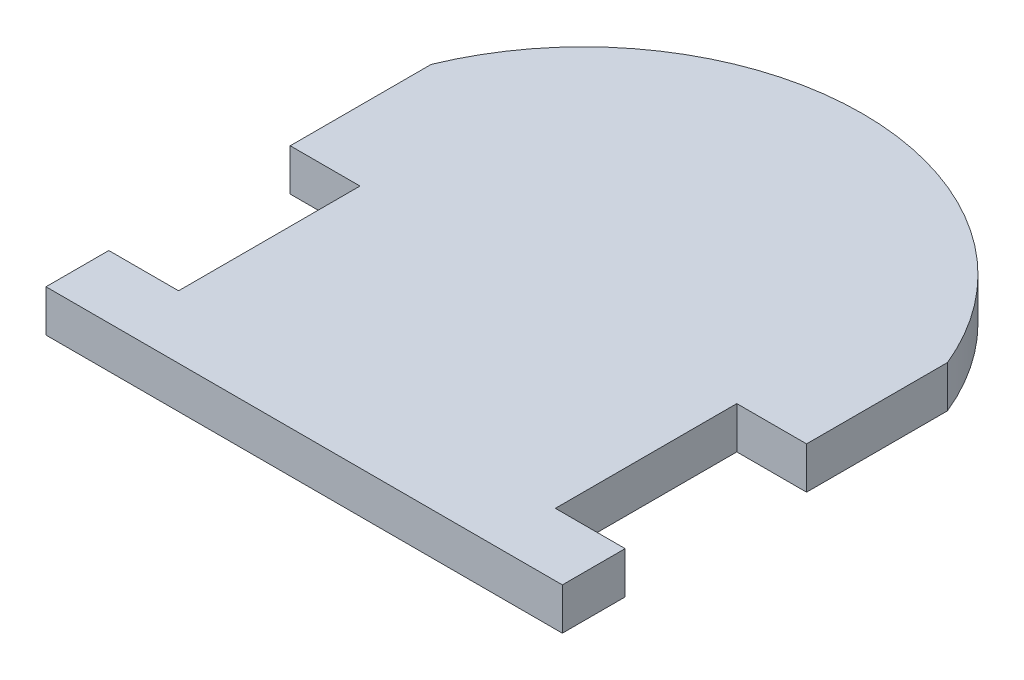
ISO-10303-21;
HEADER;
FILE_DESCRIPTION(('STEP AP214'),'2;1');
FILE_NAME('part.step','',(''),(''),'','','');
FILE_SCHEMA(('AUTOMOTIVE_DESIGN { 1 0 10303 214 1 1 1 1 }'));
ENDSEC;
DATA;
#1=APPLICATION_CONTEXT('core data for automotive mechanical design processes');
#2=APPLICATION_PROTOCOL_DEFINITION('international standard','automotive_design',2000,#1);
#3=PRODUCT_CONTEXT('',#1,'mechanical');
#4=PRODUCT('Part','Part','',(#3));
#5=PRODUCT_RELATED_PRODUCT_CATEGORY('part','',(#4));
#6=PRODUCT_DEFINITION_FORMATION('','',#4);
#7=PRODUCT_DEFINITION_CONTEXT('part definition',#1,'design');
#8=PRODUCT_DEFINITION('design','',#6,#7);
#9=PRODUCT_DEFINITION_SHAPE('','',#8);
#10=(LENGTH_UNIT() NAMED_UNIT(*) SI_UNIT(.MILLI.,.METRE.));
#11=(NAMED_UNIT(*) PLANE_ANGLE_UNIT() SI_UNIT($,.RADIAN.));
#12=(NAMED_UNIT(*) SI_UNIT($,.STERADIAN.) SOLID_ANGLE_UNIT());
#13=UNCERTAINTY_MEASURE_WITH_UNIT(LENGTH_MEASURE(1.E-05),#10,'distance_accuracy_value','');
#14=(GEOMETRIC_REPRESENTATION_CONTEXT(3) GLOBAL_UNCERTAINTY_ASSIGNED_CONTEXT((#13)) GLOBAL_UNIT_ASSIGNED_CONTEXT((#10,
#11,#12)) REPRESENTATION_CONTEXT('',''));
#15=CARTESIAN_POINT('',(0.,0.,0.));
#16=DIRECTION('',(0.,0.,1.));
#17=DIRECTION('',(1.,0.,0.));
#18=AXIS2_PLACEMENT_3D('',#15,#16,#17);
#19=CARTESIAN_POINT('',(18.5,3.,0.));
#20=DIRECTION('',(-1.,0.,0.));
#21=DIRECTION('',(0.,0.,1.));
#22=AXIS2_PLACEMENT_3D('',#19,#20,#21);
#23=PLANE('',#22);
#24=DIRECTION('',(0.,0.,-1.));
#25=VECTOR('',#24,1.);
#26=CARTESIAN_POINT('',(18.5,0.,0.));
#27=LINE('',#26,#25);
#28=CARTESIAN_POINT('',(18.5,0.,20.));
#29=VERTEX_POINT('',#28);
#30=CARTESIAN_POINT('',(18.5,0.,15.5));
#31=VERTEX_POINT('',#30);
#32=EDGE_CURVE('E178',#29,#31,#27,.T.);
#33=ORIENTED_EDGE('',*,*,#32,.T.);
#34=DIRECTION('',(0.,1.,0.));
#35=VECTOR('',#34,1.);
#36=CARTESIAN_POINT('',(18.5,3.,15.5));
#37=LINE('',#36,#35);
#38=CARTESIAN_POINT('',(18.5,3.,15.5));
#39=VERTEX_POINT('',#38);
#40=EDGE_CURVE('E159',#31,#39,#37,.T.);
#41=ORIENTED_EDGE('',*,*,#40,.T.);
#42=DIRECTION('',(0.,0.,-1.));
#43=VECTOR('',#42,1.);
#44=CARTESIAN_POINT('',(18.5,3.,0.));
#45=LINE('',#44,#43);
#46=CARTESIAN_POINT('',(18.5,3.,20.));
#47=VERTEX_POINT('',#46);
#48=EDGE_CURVE('E166',#47,#39,#45,.T.);
#49=ORIENTED_EDGE('',*,*,#48,.F.);
#50=DIRECTION('',(0.,-1.,0.));
#51=VECTOR('',#50,1.);
#52=CARTESIAN_POINT('',(18.5,3.,20.));
#53=LINE('',#52,#51);
#54=EDGE_CURVE('E177',#47,#29,#53,.T.);
#55=ORIENTED_EDGE('',*,*,#54,.T.);
#56=EDGE_LOOP('',(#33,#41,#49,#55));
#57=FACE_BOUND('',#56,.T.);
#58=ADVANCED_FACE('F35',(#57),#23,.F.);
#59=CARTESIAN_POINT('',(-18.5,3.,0.));
#60=DIRECTION('',(1.,0.,0.));
#61=DIRECTION('',(0.,0.,-1.));
#62=AXIS2_PLACEMENT_3D('',#59,#60,#61);
#63=PLANE('',#62);
#64=DIRECTION('',(0.,-1.,0.));
#65=VECTOR('',#64,1.);
#66=CARTESIAN_POINT('',(-18.5,3.,2.5));
#67=LINE('',#66,#65);
#68=CARTESIAN_POINT('',(-18.5,3.,2.5));
#69=VERTEX_POINT('',#68);
#70=CARTESIAN_POINT('',(-18.5,0.,2.5));
#71=VERTEX_POINT('',#70);
#72=EDGE_CURVE('E163',#69,#71,#67,.T.);
#73=ORIENTED_EDGE('',*,*,#72,.F.);
#74=DIRECTION('',(0.,0.,1.));
#75=VECTOR('',#74,1.);
#76=CARTESIAN_POINT('',(-18.5,3.,0.));
#77=LINE('',#76,#75);
#78=CARTESIAN_POINT('',(-18.5,3.,-7.59934207678534));
#79=VERTEX_POINT('',#78);
#80=EDGE_CURVE('E173',#79,#69,#77,.T.);
#81=ORIENTED_EDGE('',*,*,#80,.F.);
#82=DIRECTION('',(0.,-1.,0.));
#83=VECTOR('',#82,1.);
#84=CARTESIAN_POINT('',(-18.5,3.,-7.59934207678534));
#85=LINE('',#84,#83);
#86=CARTESIAN_POINT('',(-18.5,0.,-7.59934207678534));
#87=VERTEX_POINT('',#86);
#88=EDGE_CURVE('E194',#79,#87,#85,.T.);
#89=ORIENTED_EDGE('',*,*,#88,.T.);
#90=DIRECTION('',(0.,0.,1.));
#91=VECTOR('',#90,1.);
#92=CARTESIAN_POINT('',(-18.5,0.,0.));
#93=LINE('',#92,#91);
#94=EDGE_CURVE('E184',#87,#71,#93,.T.);
#95=ORIENTED_EDGE('',*,*,#94,.T.);
#96=EDGE_LOOP('',(#73,#81,#89,#95));
#97=FACE_BOUND('',#96,.T.);
#98=ADVANCED_FACE('F246',(#97),#63,.F.);
#99=DIRECTION('',(0.,1.,0.));
#100=VECTOR('',#99,1.);
#101=CARTESIAN_POINT('',(-18.5,3.,15.5));
#102=LINE('',#101,#100);
#103=CARTESIAN_POINT('',(-18.5,0.,15.5));
#104=VERTEX_POINT('',#103);
#105=CARTESIAN_POINT('',(-18.5,3.,15.5));
#106=VERTEX_POINT('',#105);
#107=EDGE_CURVE('E136',#104,#106,#102,.T.);
#108=ORIENTED_EDGE('',*,*,#107,.F.);
#109=CARTESIAN_POINT('',(-18.5,0.,20.));
#110=VERTEX_POINT('',#109);
#111=EDGE_CURVE('E183',#104,#110,#93,.T.);
#112=ORIENTED_EDGE('',*,*,#111,.T.);
#113=DIRECTION('',(0.,-1.,0.));
#114=VECTOR('',#113,1.);
#115=CARTESIAN_POINT('',(-18.5,3.,20.));
#116=LINE('',#115,#114);
#117=CARTESIAN_POINT('',(-18.5,3.,20.));
#118=VERTEX_POINT('',#117);
#119=EDGE_CURVE('E191',#118,#110,#116,.T.);
#120=ORIENTED_EDGE('',*,*,#119,.F.);
#121=EDGE_CURVE('E172',#106,#118,#77,.T.);
#122=ORIENTED_EDGE('',*,*,#121,.F.);
#123=EDGE_LOOP('',(#108,#112,#120,#122));
#124=FACE_BOUND('',#123,.T.);
#125=ADVANCED_FACE('F213',(#124),#63,.F.);
#126=CARTESIAN_POINT('',(0.,3.,0.));
#127=DIRECTION('',(0.,1.,0.));
#128=DIRECTION('',(0.,0.,1.));
#129=AXIS2_PLACEMENT_3D('',#126,#127,#128);
#130=PLANE('',#129);
#131=ORIENTED_EDGE('',*,*,#80,.T.);
#132=DIRECTION('',(1.,0.,0.));
#133=VECTOR('',#132,1.);
#134=CARTESIAN_POINT('',(0.,3.,2.5));
#135=LINE('',#134,#133);
#136=CARTESIAN_POINT('',(-13.5,3.,2.5));
#137=VERTEX_POINT('',#136);
#138=EDGE_CURVE('E130',#69,#137,#135,.T.);
#139=ORIENTED_EDGE('',*,*,#138,.T.);
#140=DIRECTION('',(0.,0.,1.));
#141=VECTOR('',#140,1.);
#142=CARTESIAN_POINT('',(-13.5,3.,0.));
#143=LINE('',#142,#141);
#144=CARTESIAN_POINT('',(-13.5,3.,15.5));
#145=VERTEX_POINT('',#144);
#146=EDGE_CURVE('E125',#137,#145,#143,.T.);
#147=ORIENTED_EDGE('',*,*,#146,.T.);
#148=DIRECTION('',(-1.,0.,0.));
#149=VECTOR('',#148,1.);
#150=CARTESIAN_POINT('',(0.,3.,15.5));
#151=LINE('',#150,#149);
#152=EDGE_CURVE('E133',#145,#106,#151,.T.);
#153=ORIENTED_EDGE('',*,*,#152,.T.);
#154=ORIENTED_EDGE('',*,*,#121,.T.);
#155=DIRECTION('',(1.,0.,0.));
#156=VECTOR('',#155,1.);
#157=CARTESIAN_POINT('',(0.,3.,20.));
#158=LINE('',#157,#156);
#159=EDGE_CURVE('E175',#118,#47,#158,.T.);
#160=ORIENTED_EDGE('',*,*,#159,.T.);
#161=ORIENTED_EDGE('',*,*,#48,.T.);
#162=DIRECTION('',(1.,0.,0.));
#163=VECTOR('',#162,1.);
#164=CARTESIAN_POINT('',(0.,3.,15.5));
#165=LINE('',#164,#163);
#166=CARTESIAN_POINT('',(13.5,3.,15.5));
#167=VERTEX_POINT('',#166);
#168=EDGE_CURVE('E148',#167,#39,#165,.T.);
#169=ORIENTED_EDGE('',*,*,#168,.F.);
#170=DIRECTION('',(0.,0.,1.));
#171=VECTOR('',#170,1.);
#172=CARTESIAN_POINT('',(13.5,3.,0.));
#173=LINE('',#172,#171);
#174=CARTESIAN_POINT('',(13.5,3.,2.5));
#175=VERTEX_POINT('',#174);
#176=EDGE_CURVE('E152',#175,#167,#173,.T.);
#177=ORIENTED_EDGE('',*,*,#176,.F.);
#178=DIRECTION('',(-1.,0.,0.));
#179=VECTOR('',#178,1.);
#180=CARTESIAN_POINT('',(0.,3.,2.5));
#181=LINE('',#180,#179);
#182=CARTESIAN_POINT('',(18.5,3.,2.5));
#183=VERTEX_POINT('',#182);
#184=EDGE_CURVE('E150',#183,#175,#181,.T.);
#185=ORIENTED_EDGE('',*,*,#184,.F.);
#186=CARTESIAN_POINT('',(18.5,3.,-7.59934207678533));
#187=VERTEX_POINT('',#186);
#188=EDGE_CURVE('E170',#183,#187,#45,.T.);
#189=ORIENTED_EDGE('',*,*,#188,.T.);
#190=CARTESIAN_POINT('',(0.,3.,0.));
#191=DIRECTION('',(0.,1.,0.));
#192=DIRECTION('',(0.,0.,1.));
#193=AXIS2_PLACEMENT_3D('',#190,#191,#192);
#194=CIRCLE('',#193,20.);
#195=EDGE_CURVE('E169',#187,#79,#194,.T.);
#196=ORIENTED_EDGE('',*,*,#195,.T.);
#197=EDGE_LOOP('',(#131,#139,#147,#153,#154,#160,#161,#169,#177,#185,#189,#196));
#198=FACE_BOUND('',#197,.T.);
#199=ADVANCED_FACE('F142',(#198),#130,.T.);
#200=CARTESIAN_POINT('',(0.,0.,0.));
#201=DIRECTION('',(0.,1.,0.));
#202=DIRECTION('',(0.,0.,1.));
#203=AXIS2_PLACEMENT_3D('',#200,#201,#202);
#204=PLANE('',#203);
#205=DIRECTION('',(1.,0.,0.));
#206=VECTOR('',#205,1.);
#207=CARTESIAN_POINT('',(0.,0.,2.5));
#208=LINE('',#207,#206);
#209=CARTESIAN_POINT('',(-13.5,0.,2.5));
#210=VERTEX_POINT('',#209);
#211=EDGE_CURVE('E11',#71,#210,#208,.T.);
#212=ORIENTED_EDGE('',*,*,#211,.F.);
#213=ORIENTED_EDGE('',*,*,#94,.F.);
#214=CARTESIAN_POINT('',(0.,0.,0.));
#215=DIRECTION('',(0.,1.,0.));
#216=DIRECTION('',(0.,0.,1.));
#217=AXIS2_PLACEMENT_3D('',#214,#215,#216);
#218=CIRCLE('',#217,20.);
#219=CARTESIAN_POINT('',(18.5,0.,-7.59934207678533));
#220=VERTEX_POINT('',#219);
#221=EDGE_CURVE('E181',#220,#87,#218,.T.);
#222=ORIENTED_EDGE('',*,*,#221,.F.);
#223=CARTESIAN_POINT('',(18.5,0.,2.5));
#224=VERTEX_POINT('',#223);
#225=EDGE_CURVE('E165',#224,#220,#27,.T.);
#226=ORIENTED_EDGE('',*,*,#225,.F.);
#227=DIRECTION('',(-1.,0.,0.));
#228=VECTOR('',#227,1.);
#229=CARTESIAN_POINT('',(0.,0.,2.5));
#230=LINE('',#229,#228);
#231=CARTESIAN_POINT('',(13.5,0.,2.5));
#232=VERTEX_POINT('',#231);
#233=EDGE_CURVE('E200',#224,#232,#230,.T.);
#234=ORIENTED_EDGE('',*,*,#233,.T.);
#235=DIRECTION('',(0.,0.,1.));
#236=VECTOR('',#235,1.);
#237=CARTESIAN_POINT('',(13.5,0.,0.));
#238=LINE('',#237,#236);
#239=CARTESIAN_POINT('',(13.5,0.,15.5));
#240=VERTEX_POINT('',#239);
#241=EDGE_CURVE('E203',#232,#240,#238,.T.);
#242=ORIENTED_EDGE('',*,*,#241,.T.);
#243=DIRECTION('',(1.,0.,0.));
#244=VECTOR('',#243,1.);
#245=CARTESIAN_POINT('',(0.,0.,15.5));
#246=LINE('',#245,#244);
#247=EDGE_CURVE('E206',#240,#31,#246,.T.);
#248=ORIENTED_EDGE('',*,*,#247,.T.);
#249=ORIENTED_EDGE('',*,*,#32,.F.);
#250=DIRECTION('',(1.,0.,0.));
#251=VECTOR('',#250,1.);
#252=CARTESIAN_POINT('',(0.,0.,20.));
#253=LINE('',#252,#251);
#254=EDGE_CURVE('E187',#110,#29,#253,.T.);
#255=ORIENTED_EDGE('',*,*,#254,.F.);
#256=ORIENTED_EDGE('',*,*,#111,.F.);
#257=DIRECTION('',(-1.,0.,0.));
#258=VECTOR('',#257,1.);
#259=CARTESIAN_POINT('',(0.,0.,15.5));
#260=LINE('',#259,#258);
#261=CARTESIAN_POINT('',(-13.5,0.,15.5));
#262=VERTEX_POINT('',#261);
#263=EDGE_CURVE('E209',#262,#104,#260,.T.);
#264=ORIENTED_EDGE('',*,*,#263,.F.);
#265=DIRECTION('',(0.,0.,1.));
#266=VECTOR('',#265,1.);
#267=CARTESIAN_POINT('',(-13.5,0.,0.));
#268=LINE('',#267,#266);
#269=EDGE_CURVE('E43',#210,#262,#268,.T.);
#270=ORIENTED_EDGE('',*,*,#269,.F.);
#271=EDGE_LOOP('',(#212,#213,#222,#226,#234,#242,#248,#249,#255,#256,#264,#270));
#272=FACE_BOUND('',#271,.T.);
#273=ADVANCED_FACE('F217',(#272),#204,.F.);
#274=ORIENTED_EDGE('',*,*,#188,.F.);
#275=DIRECTION('',(0.,-1.,0.));
#276=VECTOR('',#275,1.);
#277=CARTESIAN_POINT('',(18.5,3.,2.5));
#278=LINE('',#277,#276);
#279=EDGE_CURVE('E146',#183,#224,#278,.T.);
#280=ORIENTED_EDGE('',*,*,#279,.T.);
#281=ORIENTED_EDGE('',*,*,#225,.T.);
#282=DIRECTION('',(0.,-1.,0.));
#283=VECTOR('',#282,1.);
#284=CARTESIAN_POINT('',(18.5,3.,-7.59934207678533));
#285=LINE('',#284,#283);
#286=EDGE_CURVE('E197',#187,#220,#285,.T.);
#287=ORIENTED_EDGE('',*,*,#286,.F.);
#288=EDGE_LOOP('',(#274,#280,#281,#287));
#289=FACE_BOUND('',#288,.T.);
#290=ADVANCED_FACE('F37',(#289),#23,.F.);
#291=CARTESIAN_POINT('',(0.,3.,0.));
#292=DIRECTION('',(0.,-1.,0.));
#293=DIRECTION('',(0.,0.,-1.));
#294=AXIS2_PLACEMENT_3D('',#291,#292,#293);
#295=CYLINDRICAL_SURFACE('',#294,20.);
#296=ORIENTED_EDGE('',*,*,#221,.T.);
#297=ORIENTED_EDGE('',*,*,#88,.F.);
#298=ORIENTED_EDGE('',*,*,#195,.F.);
#299=ORIENTED_EDGE('',*,*,#286,.T.);
#300=EDGE_LOOP('',(#296,#297,#298,#299));
#301=FACE_BOUND('',#300,.T.);
#302=ADVANCED_FACE('F241',(#301),#295,.T.);
#303=CARTESIAN_POINT('',(0.,3.,20.));
#304=DIRECTION('',(0.,0.,-1.));
#305=DIRECTION('',(-1.,0.,0.));
#306=AXIS2_PLACEMENT_3D('',#303,#304,#305);
#307=PLANE('',#306);
#308=ORIENTED_EDGE('',*,*,#254,.T.);
#309=ORIENTED_EDGE('',*,*,#54,.F.);
#310=ORIENTED_EDGE('',*,*,#159,.F.);
#311=ORIENTED_EDGE('',*,*,#119,.T.);
#312=EDGE_LOOP('',(#308,#309,#310,#311));
#313=FACE_BOUND('',#312,.T.);
#314=ADVANCED_FACE('F221',(#313),#307,.F.);
#315=CARTESIAN_POINT('',(0.,-7.,15.5));
#316=DIRECTION('',(0.,0.,1.));
#317=DIRECTION('',(1.,0.,0.));
#318=AXIS2_PLACEMENT_3D('',#315,#316,#317);
#319=PLANE('',#318);
#320=ORIENTED_EDGE('',*,*,#247,.F.);
#321=DIRECTION('',(0.,1.,0.));
#322=VECTOR('',#321,1.);
#323=CARTESIAN_POINT('',(13.5,-7.,15.5));
#324=LINE('',#323,#322);
#325=EDGE_CURVE('E139',#240,#167,#324,.T.);
#326=ORIENTED_EDGE('',*,*,#325,.T.);
#327=ORIENTED_EDGE('',*,*,#168,.T.);
#328=ORIENTED_EDGE('',*,*,#40,.F.);
#329=EDGE_LOOP('',(#320,#326,#327,#328));
#330=FACE_BOUND('',#329,.T.);
#331=ADVANCED_FACE('F229',(#330),#319,.F.);
#332=CARTESIAN_POINT('',(13.5,-7.,0.));
#333=DIRECTION('',(-1.,0.,0.));
#334=DIRECTION('',(0.,0.,1.));
#335=AXIS2_PLACEMENT_3D('',#332,#333,#334);
#336=PLANE('',#335);
#337=DIRECTION('',(0.,1.,0.));
#338=VECTOR('',#337,1.);
#339=CARTESIAN_POINT('',(13.5,-7.,2.5));
#340=LINE('',#339,#338);
#341=EDGE_CURVE('E58',#232,#175,#340,.T.);
#342=ORIENTED_EDGE('',*,*,#341,.T.);
#343=ORIENTED_EDGE('',*,*,#176,.T.);
#344=ORIENTED_EDGE('',*,*,#325,.F.);
#345=ORIENTED_EDGE('',*,*,#241,.F.);
#346=EDGE_LOOP('',(#342,#343,#344,#345));
#347=FACE_BOUND('',#346,.T.);
#348=ADVANCED_FACE('F232',(#347),#336,.F.);
#349=CARTESIAN_POINT('',(0.,-7.,2.5));
#350=DIRECTION('',(0.,0.,-1.));
#351=DIRECTION('',(-1.,0.,0.));
#352=AXIS2_PLACEMENT_3D('',#349,#350,#351);
#353=PLANE('',#352);
#354=ORIENTED_EDGE('',*,*,#184,.T.);
#355=ORIENTED_EDGE('',*,*,#341,.F.);
#356=ORIENTED_EDGE('',*,*,#233,.F.);
#357=ORIENTED_EDGE('',*,*,#279,.F.);
#358=EDGE_LOOP('',(#354,#355,#356,#357));
#359=FACE_BOUND('',#358,.T.);
#360=ADVANCED_FACE('F233',(#359),#353,.F.);
#361=CARTESIAN_POINT('',(0.,-7.,2.5));
#362=DIRECTION('',(0.,0.,1.));
#363=DIRECTION('',(1.,0.,0.));
#364=AXIS2_PLACEMENT_3D('',#361,#362,#363);
#365=PLANE('',#364);
#366=ORIENTED_EDGE('',*,*,#72,.T.);
#367=ORIENTED_EDGE('',*,*,#211,.T.);
#368=DIRECTION('',(0.,1.,0.));
#369=VECTOR('',#368,1.);
#370=CARTESIAN_POINT('',(-13.5,-7.,2.5));
#371=LINE('',#370,#369);
#372=EDGE_CURVE('E129',#210,#137,#371,.T.);
#373=ORIENTED_EDGE('',*,*,#372,.T.);
#374=ORIENTED_EDGE('',*,*,#138,.F.);
#375=EDGE_LOOP('',(#366,#367,#373,#374));
#376=FACE_BOUND('',#375,.T.);
#377=ADVANCED_FACE('F249',(#376),#365,.T.);
#378=CARTESIAN_POINT('',(-13.5,-7.,0.));
#379=DIRECTION('',(-1.,0.,0.));
#380=DIRECTION('',(0.,0.,1.));
#381=AXIS2_PLACEMENT_3D('',#378,#379,#380);
#382=PLANE('',#381);
#383=ORIENTED_EDGE('',*,*,#269,.T.);
#384=DIRECTION('',(0.,1.,0.));
#385=VECTOR('',#384,1.);
#386=CARTESIAN_POINT('',(-13.5,-7.,15.5));
#387=LINE('',#386,#385);
#388=EDGE_CURVE('E50',#262,#145,#387,.T.);
#389=ORIENTED_EDGE('',*,*,#388,.T.);
#390=ORIENTED_EDGE('',*,*,#146,.F.);
#391=ORIENTED_EDGE('',*,*,#372,.F.);
#392=EDGE_LOOP('',(#383,#389,#390,#391));
#393=FACE_BOUND('',#392,.T.);
#394=ADVANCED_FACE('F122',(#393),#382,.T.);
#395=CARTESIAN_POINT('',(0.,-7.,15.5));
#396=DIRECTION('',(0.,0.,-1.));
#397=DIRECTION('',(-1.,0.,0.));
#398=AXIS2_PLACEMENT_3D('',#395,#396,#397);
#399=PLANE('',#398);
#400=ORIENTED_EDGE('',*,*,#107,.T.);
#401=ORIENTED_EDGE('',*,*,#152,.F.);
#402=ORIENTED_EDGE('',*,*,#388,.F.);
#403=ORIENTED_EDGE('',*,*,#263,.T.);
#404=EDGE_LOOP('',(#400,#401,#402,#403));
#405=FACE_BOUND('',#404,.T.);
#406=ADVANCED_FACE('F134',(#405),#399,.T.);
#407=CLOSED_SHELL('',(#58,#98,#125,#199,#273,#290,#302,#314,#331,#348,#360,#377,#394,#406));
#408=MANIFOLD_SOLID_BREP('B2',#407);
#409=ADVANCED_BREP_SHAPE_REPRESENTATION('',(#18,#408),#14);
#410=SHAPE_DEFINITION_REPRESENTATION(#9,#409);
ENDSEC;
END-ISO-10303-21;
